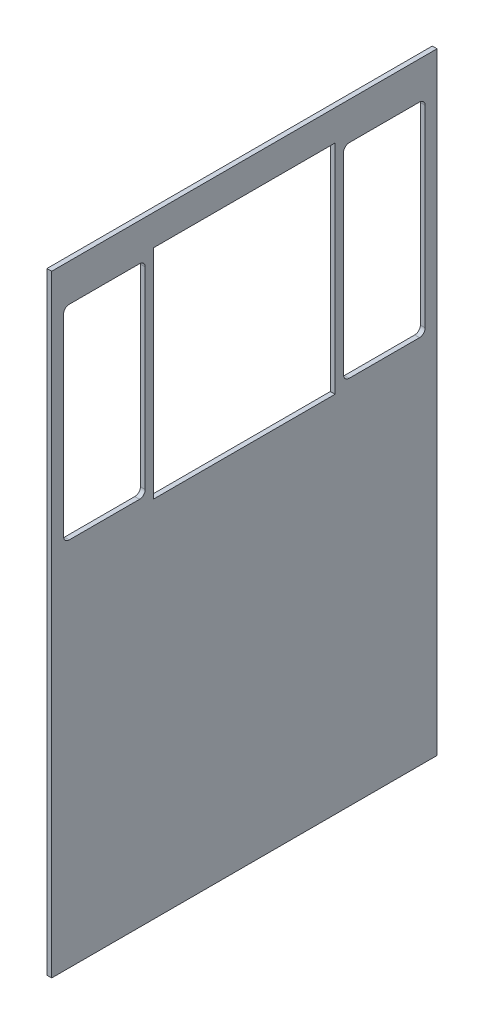
ISO-10303-21;
HEADER;
FILE_DESCRIPTION(('STEP AP214'),'2;1');
FILE_NAME('part.step','',(''),(''),'','','');
FILE_SCHEMA(('AUTOMOTIVE_DESIGN { 1 0 10303 214 1 1 1 1 }'));
ENDSEC;
DATA;
#1=APPLICATION_CONTEXT('core data for automotive mechanical design processes');
#2=APPLICATION_PROTOCOL_DEFINITION('international standard','automotive_design',2000,#1);
#3=PRODUCT_CONTEXT('',#1,'mechanical');
#4=PRODUCT('Part','Part','',(#3));
#5=PRODUCT_RELATED_PRODUCT_CATEGORY('part','',(#4));
#6=PRODUCT_DEFINITION_FORMATION('','',#4);
#7=PRODUCT_DEFINITION_CONTEXT('part definition',#1,'design');
#8=PRODUCT_DEFINITION('design','',#6,#7);
#9=PRODUCT_DEFINITION_SHAPE('','',#8);
#10=(LENGTH_UNIT() NAMED_UNIT(*) SI_UNIT(.MILLI.,.METRE.));
#11=(NAMED_UNIT(*) PLANE_ANGLE_UNIT() SI_UNIT($,.RADIAN.));
#12=(NAMED_UNIT(*) SI_UNIT($,.STERADIAN.) SOLID_ANGLE_UNIT());
#13=UNCERTAINTY_MEASURE_WITH_UNIT(LENGTH_MEASURE(1.E-05),#10,'distance_accuracy_value','');
#14=(GEOMETRIC_REPRESENTATION_CONTEXT(3) GLOBAL_UNCERTAINTY_ASSIGNED_CONTEXT((#13)) GLOBAL_UNIT_ASSIGNED_CONTEXT((#10,
#11,#12)) REPRESENTATION_CONTEXT('',''));
#15=CARTESIAN_POINT('',(0.,0.,0.));
#16=DIRECTION('',(0.,0.,1.));
#17=DIRECTION('',(1.,0.,0.));
#18=AXIS2_PLACEMENT_3D('',#15,#16,#17);
#19=CARTESIAN_POINT('',(2.667,0.,0.));
#20=DIRECTION('',(1.,0.,0.));
#21=DIRECTION('',(0.,0.,-1.));
#22=AXIS2_PLACEMENT_3D('',#19,#20,#21);
#23=PLANE('',#22);
#24=DIRECTION('',(0.,0.,1.));
#25=VECTOR('',#24,1.);
#26=CARTESIAN_POINT('',(2.667,321.945,-98.1075));
#27=LINE('',#26,#25);
#28=CARTESIAN_POINT('',(2.667,321.945,-98.1075));
#29=VERTEX_POINT('',#28);
#30=CARTESIAN_POINT('',(2.667,321.945,-58.7375));
#31=VERTEX_POINT('',#30);
#32=EDGE_CURVE('E231',#29,#31,#27,.T.);
#33=ORIENTED_EDGE('',*,*,#32,.F.);
#34=CARTESIAN_POINT('',(2.667,318.77,-98.1075));
#35=DIRECTION('',(1.,0.,0.));
#36=DIRECTION('',(0.,0.,1.));
#37=AXIS2_PLACEMENT_3D('',#34,#35,#36);
#38=CIRCLE('',#37,3.17499999999999);
#39=CARTESIAN_POINT('',(2.667,318.77,-101.2825));
#40=VERTEX_POINT('',#39);
#41=EDGE_CURVE('E229',#40,#29,#38,.T.);
#42=ORIENTED_EDGE('',*,*,#41,.F.);
#43=DIRECTION('',(0.,1.,0.));
#44=VECTOR('',#43,1.);
#45=CARTESIAN_POINT('',(2.667,210.82,-101.2825));
#46=LINE('',#45,#44);
#47=CARTESIAN_POINT('',(2.667,210.82,-101.2825));
#48=VERTEX_POINT('',#47);
#49=EDGE_CURVE('E244',#48,#40,#46,.T.);
#50=ORIENTED_EDGE('',*,*,#49,.F.);
#51=CARTESIAN_POINT('',(2.667,210.82,-98.1075));
#52=DIRECTION('',(1.,0.,0.));
#53=DIRECTION('',(0.,0.,1.));
#54=AXIS2_PLACEMENT_3D('',#51,#52,#53);
#55=CIRCLE('',#54,3.175);
#56=CARTESIAN_POINT('',(2.667,207.645,-98.1075));
#57=VERTEX_POINT('',#56);
#58=EDGE_CURVE('E242',#57,#48,#55,.T.);
#59=ORIENTED_EDGE('',*,*,#58,.F.);
#60=DIRECTION('',(0.,0.,-1.));
#61=VECTOR('',#60,1.);
#62=CARTESIAN_POINT('',(2.667,207.645,-98.1075));
#63=LINE('',#62,#61);
#64=CARTESIAN_POINT('',(2.667,207.645,-58.7375));
#65=VERTEX_POINT('',#64);
#66=EDGE_CURVE('E240',#65,#57,#63,.T.);
#67=ORIENTED_EDGE('',*,*,#66,.F.);
#68=CARTESIAN_POINT('',(2.667,210.82,-58.7375));
#69=DIRECTION('',(1.,0.,0.));
#70=DIRECTION('',(0.,0.,-1.));
#71=AXIS2_PLACEMENT_3D('',#68,#69,#70);
#72=CIRCLE('',#71,3.175);
#73=CARTESIAN_POINT('',(2.667,210.82,-55.5625));
#74=VERTEX_POINT('',#73);
#75=EDGE_CURVE('E238',#74,#65,#72,.T.);
#76=ORIENTED_EDGE('',*,*,#75,.F.);
#77=DIRECTION('',(0.,-1.,0.));
#78=VECTOR('',#77,1.);
#79=CARTESIAN_POINT('',(2.667,210.82,-55.5625));
#80=LINE('',#79,#78);
#81=CARTESIAN_POINT('',(2.667,318.77,-55.5625));
#82=VERTEX_POINT('',#81);
#83=EDGE_CURVE('E236',#82,#74,#80,.T.);
#84=ORIENTED_EDGE('',*,*,#83,.F.);
#85=CARTESIAN_POINT('',(2.667,318.77,-58.7375));
#86=DIRECTION('',(1.,0.,0.));
#87=DIRECTION('',(0.,0.,-1.));
#88=AXIS2_PLACEMENT_3D('',#85,#86,#87);
#89=CIRCLE('',#88,3.17499999999999);
#90=EDGE_CURVE('E234',#31,#82,#89,.T.);
#91=ORIENTED_EDGE('',*,*,#90,.F.);
#92=EDGE_LOOP('',(#33,#42,#50,#59,#67,#76,#84,#91));
#93=FACE_BOUND('',#92,.T.);
#94=DIRECTION('',(0.,0.,1.));
#95=VECTOR('',#94,1.);
#96=CARTESIAN_POINT('',(2.667,325.755,-50.8));
#97=LINE('',#96,#95);
#98=CARTESIAN_POINT('',(2.667,325.755,-50.8));
#99=VERTEX_POINT('',#98);
#100=CARTESIAN_POINT('',(2.667,325.755,50.8));
#101=VERTEX_POINT('',#100);
#102=EDGE_CURVE('E347',#99,#101,#97,.T.);
#103=ORIENTED_EDGE('',*,*,#102,.F.);
#104=DIRECTION('',(0.,1.,0.));
#105=VECTOR('',#104,1.);
#106=CARTESIAN_POINT('',(2.667,203.835,-50.8));
#107=LINE('',#106,#105);
#108=CARTESIAN_POINT('',(2.667,203.835,-50.8));
#109=VERTEX_POINT('',#108);
#110=EDGE_CURVE('E345',#109,#99,#107,.T.);
#111=ORIENTED_EDGE('',*,*,#110,.F.);
#112=DIRECTION('',(0.,0.,-1.));
#113=VECTOR('',#112,1.);
#114=CARTESIAN_POINT('',(2.667,203.835,-50.8));
#115=LINE('',#114,#113);
#116=CARTESIAN_POINT('',(2.667,203.835,50.8));
#117=VERTEX_POINT('',#116);
#118=EDGE_CURVE('E353',#117,#109,#115,.T.);
#119=ORIENTED_EDGE('',*,*,#118,.F.);
#120=DIRECTION('',(0.,-1.,0.));
#121=VECTOR('',#120,1.);
#122=CARTESIAN_POINT('',(2.667,203.835,50.8));
#123=LINE('',#122,#121);
#124=EDGE_CURVE('E350',#101,#117,#123,.T.);
#125=ORIENTED_EDGE('',*,*,#124,.F.);
#126=EDGE_LOOP('',(#103,#111,#119,#125));
#127=FACE_BOUND('',#126,.T.);
#128=DIRECTION('',(0.,1.,0.));
#129=VECTOR('',#128,1.);
#130=CARTESIAN_POINT('',(2.667,210.82,55.5625));
#131=LINE('',#130,#129);
#132=CARTESIAN_POINT('',(2.667,210.82,55.5625));
#133=VERTEX_POINT('',#132);
#134=CARTESIAN_POINT('',(2.667,318.77,55.5625));
#135=VERTEX_POINT('',#134);
#136=EDGE_CURVE('E288',#133,#135,#131,.T.);
#137=ORIENTED_EDGE('',*,*,#136,.F.);
#138=CARTESIAN_POINT('',(2.667,210.82,58.7375));
#139=DIRECTION('',(1.,0.,0.));
#140=DIRECTION('',(0.,0.,1.));
#141=AXIS2_PLACEMENT_3D('',#138,#139,#140);
#142=CIRCLE('',#141,3.175);
#143=CARTESIAN_POINT('',(2.667,207.645,58.7375));
#144=VERTEX_POINT('',#143);
#145=EDGE_CURVE('E286',#144,#133,#142,.T.);
#146=ORIENTED_EDGE('',*,*,#145,.F.);
#147=DIRECTION('',(0.,0.,-1.));
#148=VECTOR('',#147,1.);
#149=CARTESIAN_POINT('',(2.667,207.645,98.1075));
#150=LINE('',#149,#148);
#151=CARTESIAN_POINT('',(2.667,207.645,98.1075));
#152=VERTEX_POINT('',#151);
#153=EDGE_CURVE('E302',#152,#144,#150,.T.);
#154=ORIENTED_EDGE('',*,*,#153,.F.);
#155=CARTESIAN_POINT('',(2.667,210.82,98.1075));
#156=DIRECTION('',(1.,0.,0.));
#157=DIRECTION('',(0.,0.,-1.));
#158=AXIS2_PLACEMENT_3D('',#155,#156,#157);
#159=CIRCLE('',#158,3.175);
#160=CARTESIAN_POINT('',(2.667,210.82,101.2825));
#161=VERTEX_POINT('',#160);
#162=EDGE_CURVE('E299',#161,#152,#159,.T.);
#163=ORIENTED_EDGE('',*,*,#162,.F.);
#164=DIRECTION('',(0.,-1.,0.));
#165=VECTOR('',#164,1.);
#166=CARTESIAN_POINT('',(2.667,210.82,101.2825));
#167=LINE('',#166,#165);
#168=CARTESIAN_POINT('',(2.667,318.77,101.2825));
#169=VERTEX_POINT('',#168);
#170=EDGE_CURVE('E297',#169,#161,#167,.T.);
#171=ORIENTED_EDGE('',*,*,#170,.F.);
#172=CARTESIAN_POINT('',(2.667,318.77,98.1075));
#173=DIRECTION('',(1.,0.,0.));
#174=DIRECTION('',(0.,0.,-1.));
#175=AXIS2_PLACEMENT_3D('',#172,#173,#174);
#176=CIRCLE('',#175,3.17499999999999);
#177=CARTESIAN_POINT('',(2.667,321.945,98.1075));
#178=VERTEX_POINT('',#177);
#179=EDGE_CURVE('E295',#178,#169,#176,.T.);
#180=ORIENTED_EDGE('',*,*,#179,.F.);
#181=DIRECTION('',(0.,0.,1.));
#182=VECTOR('',#181,1.);
#183=CARTESIAN_POINT('',(2.667,321.945,98.1075));
#184=LINE('',#183,#182);
#185=CARTESIAN_POINT('',(2.667,321.945,58.7375));
#186=VERTEX_POINT('',#185);
#187=EDGE_CURVE('E293',#186,#178,#184,.T.);
#188=ORIENTED_EDGE('',*,*,#187,.F.);
#189=CARTESIAN_POINT('',(2.667,318.77,58.7375));
#190=DIRECTION('',(1.,0.,0.));
#191=DIRECTION('',(0.,0.,1.));
#192=AXIS2_PLACEMENT_3D('',#189,#190,#191);
#193=CIRCLE('',#192,3.17499999999999);
#194=EDGE_CURVE('E291',#135,#186,#193,.T.);
#195=ORIENTED_EDGE('',*,*,#194,.F.);
#196=EDGE_LOOP('',(#137,#146,#154,#163,#171,#180,#188,#195));
#197=FACE_BOUND('',#196,.T.);
#198=DIRECTION('',(0.,0.,1.));
#199=VECTOR('',#198,1.);
#200=CARTESIAN_POINT('',(2.667,342.9,0.));
#201=LINE('',#200,#199);
#202=CARTESIAN_POINT('',(2.667,342.9,-107.95));
#203=VERTEX_POINT('',#202);
#204=CARTESIAN_POINT('',(2.667,342.9,107.95));
#205=VERTEX_POINT('',#204);
#206=EDGE_CURVE('E217',#203,#205,#201,.T.);
#207=ORIENTED_EDGE('',*,*,#206,.T.);
#208=DIRECTION('',(0.,-1.,0.));
#209=VECTOR('',#208,1.);
#210=CARTESIAN_POINT('',(2.667,0.,107.95));
#211=LINE('',#210,#209);
#212=CARTESIAN_POINT('',(2.667,0.,107.95));
#213=VERTEX_POINT('',#212);
#214=EDGE_CURVE('E210',#205,#213,#211,.T.);
#215=ORIENTED_EDGE('',*,*,#214,.T.);
#216=DIRECTION('',(0.,0.,-1.));
#217=VECTOR('',#216,1.);
#218=CARTESIAN_POINT('',(2.667,0.,-114.3));
#219=LINE('',#218,#217);
#220=CARTESIAN_POINT('',(2.667,0.,-107.95));
#221=VERTEX_POINT('',#220);
#222=EDGE_CURVE('E11',#213,#221,#219,.T.);
#223=ORIENTED_EDGE('',*,*,#222,.T.);
#224=DIRECTION('',(0.,1.,0.));
#225=VECTOR('',#224,1.);
#226=CARTESIAN_POINT('',(2.667,0.,-107.95));
#227=LINE('',#226,#225);
#228=EDGE_CURVE('E47',#221,#203,#227,.T.);
#229=ORIENTED_EDGE('',*,*,#228,.T.);
#230=EDGE_LOOP('',(#207,#215,#223,#229));
#231=FACE_BOUND('',#230,.T.);
#232=ADVANCED_FACE('F32',(#93,#127,#197,#231),#23,.T.);
#233=CARTESIAN_POINT('',(0.,0.,0.));
#234=DIRECTION('',(1.,0.,0.));
#235=DIRECTION('',(0.,0.,-1.));
#236=AXIS2_PLACEMENT_3D('',#233,#234,#235);
#237=PLANE('',#236);
#238=CARTESIAN_POINT('',(0.,318.77,-98.1075));
#239=DIRECTION('',(1.,0.,0.));
#240=DIRECTION('',(0.,0.,1.));
#241=AXIS2_PLACEMENT_3D('',#238,#239,#240);
#242=CIRCLE('',#241,3.17499999999999);
#243=CARTESIAN_POINT('',(0.,318.77,-101.2825));
#244=VERTEX_POINT('',#243);
#245=CARTESIAN_POINT('',(0.,321.945,-98.1075));
#246=VERTEX_POINT('',#245);
#247=EDGE_CURVE('E225',#244,#246,#242,.T.);
#248=ORIENTED_EDGE('',*,*,#247,.T.);
#249=DIRECTION('',(0.,0.,1.));
#250=VECTOR('',#249,1.);
#251=CARTESIAN_POINT('',(0.,321.945,-98.1075));
#252=LINE('',#251,#250);
#253=CARTESIAN_POINT('',(0.,321.945,-58.7375));
#254=VERTEX_POINT('',#253);
#255=EDGE_CURVE('E249',#246,#254,#252,.T.);
#256=ORIENTED_EDGE('',*,*,#255,.T.);
#257=CARTESIAN_POINT('',(0.,318.77,-58.7375));
#258=DIRECTION('',(1.,0.,0.));
#259=DIRECTION('',(0.,0.,-1.));
#260=AXIS2_PLACEMENT_3D('',#257,#258,#259);
#261=CIRCLE('',#260,3.17499999999999);
#262=CARTESIAN_POINT('',(0.,318.77,-55.5625));
#263=VERTEX_POINT('',#262);
#264=EDGE_CURVE('E252',#254,#263,#261,.T.);
#265=ORIENTED_EDGE('',*,*,#264,.T.);
#266=DIRECTION('',(0.,-1.,0.));
#267=VECTOR('',#266,1.);
#268=CARTESIAN_POINT('',(0.,210.82,-55.5625));
#269=LINE('',#268,#267);
#270=CARTESIAN_POINT('',(0.,210.82,-55.5625));
#271=VERTEX_POINT('',#270);
#272=EDGE_CURVE('E255',#263,#271,#269,.T.);
#273=ORIENTED_EDGE('',*,*,#272,.T.);
#274=CARTESIAN_POINT('',(0.,210.82,-58.7375));
#275=DIRECTION('',(1.,0.,0.));
#276=DIRECTION('',(0.,0.,-1.));
#277=AXIS2_PLACEMENT_3D('',#274,#275,#276);
#278=CIRCLE('',#277,3.175);
#279=CARTESIAN_POINT('',(0.,207.645,-58.7375));
#280=VERTEX_POINT('',#279);
#281=EDGE_CURVE('E258',#271,#280,#278,.T.);
#282=ORIENTED_EDGE('',*,*,#281,.T.);
#283=DIRECTION('',(0.,0.,-1.));
#284=VECTOR('',#283,1.);
#285=CARTESIAN_POINT('',(0.,207.645,-98.1075));
#286=LINE('',#285,#284);
#287=CARTESIAN_POINT('',(0.,207.645,-98.1075));
#288=VERTEX_POINT('',#287);
#289=EDGE_CURVE('E261',#280,#288,#286,.T.);
#290=ORIENTED_EDGE('',*,*,#289,.T.);
#291=CARTESIAN_POINT('',(0.,210.82,-98.1075));
#292=DIRECTION('',(1.,0.,0.));
#293=DIRECTION('',(0.,0.,1.));
#294=AXIS2_PLACEMENT_3D('',#291,#292,#293);
#295=CIRCLE('',#294,3.175);
#296=CARTESIAN_POINT('',(0.,210.82,-101.2825));
#297=VERTEX_POINT('',#296);
#298=EDGE_CURVE('E264',#288,#297,#295,.T.);
#299=ORIENTED_EDGE('',*,*,#298,.T.);
#300=DIRECTION('',(0.,1.,0.));
#301=VECTOR('',#300,1.);
#302=CARTESIAN_POINT('',(0.,210.82,-101.2825));
#303=LINE('',#302,#301);
#304=EDGE_CURVE('E232',#297,#244,#303,.T.);
#305=ORIENTED_EDGE('',*,*,#304,.T.);
#306=EDGE_LOOP('',(#248,#256,#265,#273,#282,#290,#299,#305));
#307=FACE_BOUND('',#306,.T.);
#308=DIRECTION('',(0.,1.,0.));
#309=VECTOR('',#308,1.);
#310=CARTESIAN_POINT('',(0.,203.835,-50.8));
#311=LINE('',#310,#309);
#312=CARTESIAN_POINT('',(0.,203.835,-50.8));
#313=VERTEX_POINT('',#312);
#314=CARTESIAN_POINT('',(0.,325.755,-50.8));
#315=VERTEX_POINT('',#314);
#316=EDGE_CURVE('E344',#313,#315,#311,.T.);
#317=ORIENTED_EDGE('',*,*,#316,.T.);
#318=DIRECTION('',(0.,0.,1.));
#319=VECTOR('',#318,1.);
#320=CARTESIAN_POINT('',(0.,325.755,-50.8));
#321=LINE('',#320,#319);
#322=CARTESIAN_POINT('',(0.,325.755,50.8));
#323=VERTEX_POINT('',#322);
#324=EDGE_CURVE('E358',#315,#323,#321,.T.);
#325=ORIENTED_EDGE('',*,*,#324,.T.);
#326=DIRECTION('',(0.,-1.,0.));
#327=VECTOR('',#326,1.);
#328=CARTESIAN_POINT('',(0.,203.835,50.8));
#329=LINE('',#328,#327);
#330=CARTESIAN_POINT('',(0.,203.835,50.8));
#331=VERTEX_POINT('',#330);
#332=EDGE_CURVE('E361',#323,#331,#329,.T.);
#333=ORIENTED_EDGE('',*,*,#332,.T.);
#334=DIRECTION('',(0.,0.,-1.));
#335=VECTOR('',#334,1.);
#336=CARTESIAN_POINT('',(0.,203.835,-50.8));
#337=LINE('',#336,#335);
#338=EDGE_CURVE('E348',#331,#313,#337,.T.);
#339=ORIENTED_EDGE('',*,*,#338,.T.);
#340=EDGE_LOOP('',(#317,#325,#333,#339));
#341=FACE_BOUND('',#340,.T.);
#342=CARTESIAN_POINT('',(0.,210.82,58.7375));
#343=DIRECTION('',(1.,0.,0.));
#344=DIRECTION('',(0.,0.,1.));
#345=AXIS2_PLACEMENT_3D('',#342,#343,#344);
#346=CIRCLE('',#345,3.175);
#347=CARTESIAN_POINT('',(0.,207.645,58.7375));
#348=VERTEX_POINT('',#347);
#349=CARTESIAN_POINT('',(0.,210.82,55.5625));
#350=VERTEX_POINT('',#349);
#351=EDGE_CURVE('E285',#348,#350,#346,.T.);
#352=ORIENTED_EDGE('',*,*,#351,.T.);
#353=DIRECTION('',(0.,1.,0.));
#354=VECTOR('',#353,1.);
#355=CARTESIAN_POINT('',(0.,210.82,55.5625));
#356=LINE('',#355,#354);
#357=CARTESIAN_POINT('',(0.,318.77,55.5625));
#358=VERTEX_POINT('',#357);
#359=EDGE_CURVE('E307',#350,#358,#356,.T.);
#360=ORIENTED_EDGE('',*,*,#359,.T.);
#361=CARTESIAN_POINT('',(0.,318.77,58.7375));
#362=DIRECTION('',(1.,0.,0.));
#363=DIRECTION('',(0.,0.,1.));
#364=AXIS2_PLACEMENT_3D('',#361,#362,#363);
#365=CIRCLE('',#364,3.17499999999999);
#366=CARTESIAN_POINT('',(0.,321.945,58.7375));
#367=VERTEX_POINT('',#366);
#368=EDGE_CURVE('E310',#358,#367,#365,.T.);
#369=ORIENTED_EDGE('',*,*,#368,.T.);
#370=DIRECTION('',(0.,0.,1.));
#371=VECTOR('',#370,1.);
#372=CARTESIAN_POINT('',(0.,321.945,98.1075));
#373=LINE('',#372,#371);
#374=CARTESIAN_POINT('',(0.,321.945,98.1075));
#375=VERTEX_POINT('',#374);
#376=EDGE_CURVE('E313',#367,#375,#373,.T.);
#377=ORIENTED_EDGE('',*,*,#376,.T.);
#378=CARTESIAN_POINT('',(0.,318.77,98.1075));
#379=DIRECTION('',(1.,0.,0.));
#380=DIRECTION('',(0.,0.,-1.));
#381=AXIS2_PLACEMENT_3D('',#378,#379,#380);
#382=CIRCLE('',#381,3.17499999999999);
#383=CARTESIAN_POINT('',(0.,318.77,101.2825));
#384=VERTEX_POINT('',#383);
#385=EDGE_CURVE('E316',#375,#384,#382,.T.);
#386=ORIENTED_EDGE('',*,*,#385,.T.);
#387=DIRECTION('',(0.,-1.,0.));
#388=VECTOR('',#387,1.);
#389=CARTESIAN_POINT('',(0.,210.82,101.2825));
#390=LINE('',#389,#388);
#391=CARTESIAN_POINT('',(0.,210.82,101.2825));
#392=VERTEX_POINT('',#391);
#393=EDGE_CURVE('E319',#384,#392,#390,.T.);
#394=ORIENTED_EDGE('',*,*,#393,.T.);
#395=CARTESIAN_POINT('',(0.,210.82,98.1075));
#396=DIRECTION('',(1.,0.,0.));
#397=DIRECTION('',(0.,0.,-1.));
#398=AXIS2_PLACEMENT_3D('',#395,#396,#397);
#399=CIRCLE('',#398,3.175);
#400=CARTESIAN_POINT('',(0.,207.645,98.1075));
#401=VERTEX_POINT('',#400);
#402=EDGE_CURVE('E322',#392,#401,#399,.T.);
#403=ORIENTED_EDGE('',*,*,#402,.T.);
#404=DIRECTION('',(0.,0.,-1.));
#405=VECTOR('',#404,1.);
#406=CARTESIAN_POINT('',(0.,207.645,98.1075));
#407=LINE('',#406,#405);
#408=EDGE_CURVE('E289',#401,#348,#407,.T.);
#409=ORIENTED_EDGE('',*,*,#408,.T.);
#410=EDGE_LOOP('',(#352,#360,#369,#377,#386,#394,#403,#409));
#411=FACE_BOUND('',#410,.T.);
#412=DIRECTION('',(0.,-1.,0.));
#413=VECTOR('',#412,1.);
#414=CARTESIAN_POINT('',(0.,0.,107.95));
#415=LINE('',#414,#413);
#416=CARTESIAN_POINT('',(0.,342.9,107.95));
#417=VERTEX_POINT('',#416);
#418=CARTESIAN_POINT('',(0.,0.,107.95));
#419=VERTEX_POINT('',#418);
#420=EDGE_CURVE('E204',#417,#419,#415,.T.);
#421=ORIENTED_EDGE('',*,*,#420,.F.);
#422=DIRECTION('',(0.,0.,1.));
#423=VECTOR('',#422,1.);
#424=CARTESIAN_POINT('',(0.,342.9,0.));
#425=LINE('',#424,#423);
#426=CARTESIAN_POINT('',(0.,342.9,-107.95));
#427=VERTEX_POINT('',#426);
#428=EDGE_CURVE('E193',#427,#417,#425,.T.);
#429=ORIENTED_EDGE('',*,*,#428,.F.);
#430=DIRECTION('',(0.,1.,0.));
#431=VECTOR('',#430,1.);
#432=CARTESIAN_POINT('',(0.,0.,-107.95));
#433=LINE('',#432,#431);
#434=CARTESIAN_POINT('',(0.,0.,-107.95));
#435=VERTEX_POINT('',#434);
#436=EDGE_CURVE('E203',#435,#427,#433,.T.);
#437=ORIENTED_EDGE('',*,*,#436,.F.);
#438=DIRECTION('',(0.,0.,-1.));
#439=VECTOR('',#438,1.);
#440=CARTESIAN_POINT('',(0.,0.,-114.3));
#441=LINE('',#440,#439);
#442=EDGE_CURVE('E36',#419,#435,#441,.T.);
#443=ORIENTED_EDGE('',*,*,#442,.F.);
#444=EDGE_LOOP('',(#421,#429,#437,#443));
#445=FACE_BOUND('',#444,.T.);
#446=ADVANCED_FACE('F214',(#307,#341,#411,#445),#237,.F.);
#447=CARTESIAN_POINT('',(2.667,0.,-114.3));
#448=DIRECTION('',(0.,1.,0.));
#449=DIRECTION('',(0.,0.,1.));
#450=AXIS2_PLACEMENT_3D('',#447,#448,#449);
#451=PLANE('',#450);
#452=DIRECTION('',(1.,0.,0.));
#453=VECTOR('',#452,1.);
#454=CARTESIAN_POINT('',(0.,0.,107.95));
#455=LINE('',#454,#453);
#456=EDGE_CURVE('E223',#419,#213,#455,.T.);
#457=ORIENTED_EDGE('',*,*,#456,.F.);
#458=ORIENTED_EDGE('',*,*,#442,.T.);
#459=DIRECTION('',(1.,0.,0.));
#460=VECTOR('',#459,1.);
#461=CARTESIAN_POINT('',(0.,0.,-107.95));
#462=LINE('',#461,#460);
#463=EDGE_CURVE('E226',#435,#221,#462,.T.);
#464=ORIENTED_EDGE('',*,*,#463,.T.);
#465=ORIENTED_EDGE('',*,*,#222,.F.);
#466=EDGE_LOOP('',(#457,#458,#464,#465));
#467=FACE_BOUND('',#466,.T.);
#468=ADVANCED_FACE('F34',(#467),#451,.F.);
#469=CARTESIAN_POINT('',(2.667,203.835,-50.8));
#470=DIRECTION('',(0.,0.,1.));
#471=DIRECTION('',(1.,0.,0.));
#472=AXIS2_PLACEMENT_3D('',#469,#470,#471);
#473=PLANE('',#472);
#474=ORIENTED_EDGE('',*,*,#316,.F.);
#475=DIRECTION('',(-1.,0.,0.));
#476=VECTOR('',#475,1.);
#477=CARTESIAN_POINT('',(2.667,203.835,-50.8));
#478=LINE('',#477,#476);
#479=EDGE_CURVE('E355',#109,#313,#478,.T.);
#480=ORIENTED_EDGE('',*,*,#479,.F.);
#481=ORIENTED_EDGE('',*,*,#110,.T.);
#482=DIRECTION('',(-1.,0.,0.));
#483=VECTOR('',#482,1.);
#484=CARTESIAN_POINT('',(2.667,325.755,-50.8));
#485=LINE('',#484,#483);
#486=EDGE_CURVE('E372',#99,#315,#485,.T.);
#487=ORIENTED_EDGE('',*,*,#486,.T.);
#488=EDGE_LOOP('',(#474,#480,#481,#487));
#489=FACE_BOUND('',#488,.T.);
#490=ADVANCED_FACE('F389',(#489),#473,.T.);
#491=CARTESIAN_POINT('',(2.667,325.755,-50.8));
#492=DIRECTION('',(0.,-1.,0.));
#493=DIRECTION('',(0.,0.,-1.));
#494=AXIS2_PLACEMENT_3D('',#491,#492,#493);
#495=PLANE('',#494);
#496=ORIENTED_EDGE('',*,*,#324,.F.);
#497=ORIENTED_EDGE('',*,*,#486,.F.);
#498=ORIENTED_EDGE('',*,*,#102,.T.);
#499=DIRECTION('',(-1.,0.,0.));
#500=VECTOR('',#499,1.);
#501=CARTESIAN_POINT('',(2.667,325.755,50.8));
#502=LINE('',#501,#500);
#503=EDGE_CURVE('E370',#101,#323,#502,.T.);
#504=ORIENTED_EDGE('',*,*,#503,.T.);
#505=EDGE_LOOP('',(#496,#497,#498,#504));
#506=FACE_BOUND('',#505,.T.);
#507=ADVANCED_FACE('F392',(#506),#495,.T.);
#508=CARTESIAN_POINT('',(2.667,203.835,50.8));
#509=DIRECTION('',(0.,0.,-1.));
#510=DIRECTION('',(-1.,0.,0.));
#511=AXIS2_PLACEMENT_3D('',#508,#509,#510);
#512=PLANE('',#511);
#513=ORIENTED_EDGE('',*,*,#332,.F.);
#514=ORIENTED_EDGE('',*,*,#503,.F.);
#515=ORIENTED_EDGE('',*,*,#124,.T.);
#516=DIRECTION('',(-1.,0.,0.));
#517=VECTOR('',#516,1.);
#518=CARTESIAN_POINT('',(2.667,203.835,50.8));
#519=LINE('',#518,#517);
#520=EDGE_CURVE('E368',#117,#331,#519,.T.);
#521=ORIENTED_EDGE('',*,*,#520,.T.);
#522=EDGE_LOOP('',(#513,#514,#515,#521));
#523=FACE_BOUND('',#522,.T.);
#524=ADVANCED_FACE('F395',(#523),#512,.T.);
#525=CARTESIAN_POINT('',(2.667,203.835,-50.8));
#526=DIRECTION('',(0.,1.,0.));
#527=DIRECTION('',(0.,0.,1.));
#528=AXIS2_PLACEMENT_3D('',#525,#526,#527);
#529=PLANE('',#528);
#530=ORIENTED_EDGE('',*,*,#338,.F.);
#531=ORIENTED_EDGE('',*,*,#520,.F.);
#532=ORIENTED_EDGE('',*,*,#118,.T.);
#533=ORIENTED_EDGE('',*,*,#479,.T.);
#534=EDGE_LOOP('',(#530,#531,#532,#533));
#535=FACE_BOUND('',#534,.T.);
#536=ADVANCED_FACE('F399',(#535),#529,.T.);
#537=CARTESIAN_POINT('',(2.667,210.82,58.7375));
#538=DIRECTION('',(-1.,0.,0.));
#539=DIRECTION('',(0.,0.,1.));
#540=AXIS2_PLACEMENT_3D('',#537,#538,#539);
#541=CYLINDRICAL_SURFACE('',#540,3.175);
#542=ORIENTED_EDGE('',*,*,#351,.F.);
#543=DIRECTION('',(-1.,0.,0.));
#544=VECTOR('',#543,1.);
#545=CARTESIAN_POINT('',(2.667,207.645,58.7375));
#546=LINE('',#545,#544);
#547=EDGE_CURVE('E304',#144,#348,#546,.T.);
#548=ORIENTED_EDGE('',*,*,#547,.F.);
#549=ORIENTED_EDGE('',*,*,#145,.T.);
#550=DIRECTION('',(-1.,0.,0.));
#551=VECTOR('',#550,1.);
#552=CARTESIAN_POINT('',(2.667,210.82,55.5625));
#553=LINE('',#552,#551);
#554=EDGE_CURVE('E341',#133,#350,#553,.T.);
#555=ORIENTED_EDGE('',*,*,#554,.T.);
#556=EDGE_LOOP('',(#542,#548,#549,#555));
#557=FACE_BOUND('',#556,.T.);
#558=ADVANCED_FACE('F403',(#557),#541,.F.);
#559=CARTESIAN_POINT('',(2.667,210.82,55.5625));
#560=DIRECTION('',(0.,0.,1.));
#561=DIRECTION('',(1.,0.,0.));
#562=AXIS2_PLACEMENT_3D('',#559,#560,#561);
#563=PLANE('',#562);
#564=ORIENTED_EDGE('',*,*,#359,.F.);
#565=ORIENTED_EDGE('',*,*,#554,.F.);
#566=ORIENTED_EDGE('',*,*,#136,.T.);
#567=DIRECTION('',(-1.,0.,0.));
#568=VECTOR('',#567,1.);
#569=CARTESIAN_POINT('',(2.667,318.77,55.5625));
#570=LINE('',#569,#568);
#571=EDGE_CURVE('E339',#135,#358,#570,.T.);
#572=ORIENTED_EDGE('',*,*,#571,.T.);
#573=EDGE_LOOP('',(#564,#565,#566,#572));
#574=FACE_BOUND('',#573,.T.);
#575=ADVANCED_FACE('F407',(#574),#563,.T.);
#576=CARTESIAN_POINT('',(2.667,318.77,58.7375));
#577=DIRECTION('',(-1.,0.,0.));
#578=DIRECTION('',(0.,0.,1.));
#579=AXIS2_PLACEMENT_3D('',#576,#577,#578);
#580=CYLINDRICAL_SURFACE('',#579,3.17499999999999);
#581=ORIENTED_EDGE('',*,*,#368,.F.);
#582=ORIENTED_EDGE('',*,*,#571,.F.);
#583=ORIENTED_EDGE('',*,*,#194,.T.);
#584=DIRECTION('',(-1.,0.,0.));
#585=VECTOR('',#584,1.);
#586=CARTESIAN_POINT('',(2.667,321.945,58.7375));
#587=LINE('',#586,#585);
#588=EDGE_CURVE('E337',#186,#367,#587,.T.);
#589=ORIENTED_EDGE('',*,*,#588,.T.);
#590=EDGE_LOOP('',(#581,#582,#583,#589));
#591=FACE_BOUND('',#590,.T.);
#592=ADVANCED_FACE('F411',(#591),#580,.F.);
#593=CARTESIAN_POINT('',(2.667,321.945,98.1075));
#594=DIRECTION('',(0.,-1.,0.));
#595=DIRECTION('',(0.,0.,-1.));
#596=AXIS2_PLACEMENT_3D('',#593,#594,#595);
#597=PLANE('',#596);
#598=ORIENTED_EDGE('',*,*,#376,.F.);
#599=ORIENTED_EDGE('',*,*,#588,.F.);
#600=ORIENTED_EDGE('',*,*,#187,.T.);
#601=DIRECTION('',(-1.,0.,0.));
#602=VECTOR('',#601,1.);
#603=CARTESIAN_POINT('',(2.667,321.945,98.1075));
#604=LINE('',#603,#602);
#605=EDGE_CURVE('E335',#178,#375,#604,.T.);
#606=ORIENTED_EDGE('',*,*,#605,.T.);
#607=EDGE_LOOP('',(#598,#599,#600,#606));
#608=FACE_BOUND('',#607,.T.);
#609=ADVANCED_FACE('F415',(#608),#597,.T.);
#610=CARTESIAN_POINT('',(2.667,318.77,98.1075));
#611=DIRECTION('',(-1.,0.,0.));
#612=DIRECTION('',(0.,0.,1.));
#613=AXIS2_PLACEMENT_3D('',#610,#611,#612);
#614=CYLINDRICAL_SURFACE('',#613,3.17499999999999);
#615=ORIENTED_EDGE('',*,*,#385,.F.);
#616=ORIENTED_EDGE('',*,*,#605,.F.);
#617=ORIENTED_EDGE('',*,*,#179,.T.);
#618=DIRECTION('',(-1.,0.,0.));
#619=VECTOR('',#618,1.);
#620=CARTESIAN_POINT('',(2.667,318.77,101.2825));
#621=LINE('',#620,#619);
#622=EDGE_CURVE('E333',#169,#384,#621,.T.);
#623=ORIENTED_EDGE('',*,*,#622,.T.);
#624=EDGE_LOOP('',(#615,#616,#617,#623));
#625=FACE_BOUND('',#624,.T.);
#626=ADVANCED_FACE('F419',(#625),#614,.F.);
#627=CARTESIAN_POINT('',(2.667,210.82,101.2825));
#628=DIRECTION('',(0.,0.,-1.));
#629=DIRECTION('',(-1.,0.,0.));
#630=AXIS2_PLACEMENT_3D('',#627,#628,#629);
#631=PLANE('',#630);
#632=ORIENTED_EDGE('',*,*,#393,.F.);
#633=ORIENTED_EDGE('',*,*,#622,.F.);
#634=ORIENTED_EDGE('',*,*,#170,.T.);
#635=DIRECTION('',(-1.,0.,0.));
#636=VECTOR('',#635,1.);
#637=CARTESIAN_POINT('',(2.667,210.82,101.2825));
#638=LINE('',#637,#636);
#639=EDGE_CURVE('E331',#161,#392,#638,.T.);
#640=ORIENTED_EDGE('',*,*,#639,.T.);
#641=EDGE_LOOP('',(#632,#633,#634,#640));
#642=FACE_BOUND('',#641,.T.);
#643=ADVANCED_FACE('F423',(#642),#631,.T.);
#644=CARTESIAN_POINT('',(2.667,210.82,98.1075));
#645=DIRECTION('',(-1.,0.,0.));
#646=DIRECTION('',(0.,0.,1.));
#647=AXIS2_PLACEMENT_3D('',#644,#645,#646);
#648=CYLINDRICAL_SURFACE('',#647,3.175);
#649=ORIENTED_EDGE('',*,*,#402,.F.);
#650=ORIENTED_EDGE('',*,*,#639,.F.);
#651=ORIENTED_EDGE('',*,*,#162,.T.);
#652=DIRECTION('',(-1.,0.,0.));
#653=VECTOR('',#652,1.);
#654=CARTESIAN_POINT('',(2.667,207.645,98.1075));
#655=LINE('',#654,#653);
#656=EDGE_CURVE('E329',#152,#401,#655,.T.);
#657=ORIENTED_EDGE('',*,*,#656,.T.);
#658=EDGE_LOOP('',(#649,#650,#651,#657));
#659=FACE_BOUND('',#658,.T.);
#660=ADVANCED_FACE('F427',(#659),#648,.F.);
#661=CARTESIAN_POINT('',(2.667,207.645,98.1075));
#662=DIRECTION('',(0.,1.,0.));
#663=DIRECTION('',(0.,0.,1.));
#664=AXIS2_PLACEMENT_3D('',#661,#662,#663);
#665=PLANE('',#664);
#666=ORIENTED_EDGE('',*,*,#408,.F.);
#667=ORIENTED_EDGE('',*,*,#656,.F.);
#668=ORIENTED_EDGE('',*,*,#153,.T.);
#669=ORIENTED_EDGE('',*,*,#547,.T.);
#670=EDGE_LOOP('',(#666,#667,#668,#669));
#671=FACE_BOUND('',#670,.T.);
#672=ADVANCED_FACE('F431',(#671),#665,.T.);
#673=CARTESIAN_POINT('',(2.667,318.77,-98.1075));
#674=DIRECTION('',(-1.,0.,0.));
#675=DIRECTION('',(0.,0.,1.));
#676=AXIS2_PLACEMENT_3D('',#673,#674,#675);
#677=CYLINDRICAL_SURFACE('',#676,3.17499999999999);
#678=ORIENTED_EDGE('',*,*,#247,.F.);
#679=DIRECTION('',(-1.,0.,0.));
#680=VECTOR('',#679,1.);
#681=CARTESIAN_POINT('',(2.667,318.77,-101.2825));
#682=LINE('',#681,#680);
#683=EDGE_CURVE('E246',#40,#244,#682,.T.);
#684=ORIENTED_EDGE('',*,*,#683,.F.);
#685=ORIENTED_EDGE('',*,*,#41,.T.);
#686=DIRECTION('',(-1.,0.,0.));
#687=VECTOR('',#686,1.);
#688=CARTESIAN_POINT('',(2.667,321.945,-98.1075));
#689=LINE('',#688,#687);
#690=EDGE_CURVE('E282',#29,#246,#689,.T.);
#691=ORIENTED_EDGE('',*,*,#690,.T.);
#692=EDGE_LOOP('',(#678,#684,#685,#691));
#693=FACE_BOUND('',#692,.T.);
#694=ADVANCED_FACE('F435',(#693),#677,.F.);
#695=CARTESIAN_POINT('',(2.667,321.945,-98.1075));
#696=DIRECTION('',(0.,-1.,0.));
#697=DIRECTION('',(0.,0.,-1.));
#698=AXIS2_PLACEMENT_3D('',#695,#696,#697);
#699=PLANE('',#698);
#700=ORIENTED_EDGE('',*,*,#255,.F.);
#701=ORIENTED_EDGE('',*,*,#690,.F.);
#702=ORIENTED_EDGE('',*,*,#32,.T.);
#703=DIRECTION('',(-1.,0.,0.));
#704=VECTOR('',#703,1.);
#705=CARTESIAN_POINT('',(2.667,321.945,-58.7375));
#706=LINE('',#705,#704);
#707=EDGE_CURVE('E280',#31,#254,#706,.T.);
#708=ORIENTED_EDGE('',*,*,#707,.T.);
#709=EDGE_LOOP('',(#700,#701,#702,#708));
#710=FACE_BOUND('',#709,.T.);
#711=ADVANCED_FACE('F439',(#710),#699,.T.);
#712=CARTESIAN_POINT('',(2.667,318.77,-58.7375));
#713=DIRECTION('',(-1.,0.,0.));
#714=DIRECTION('',(0.,0.,1.));
#715=AXIS2_PLACEMENT_3D('',#712,#713,#714);
#716=CYLINDRICAL_SURFACE('',#715,3.17499999999999);
#717=ORIENTED_EDGE('',*,*,#264,.F.);
#718=ORIENTED_EDGE('',*,*,#707,.F.);
#719=ORIENTED_EDGE('',*,*,#90,.T.);
#720=DIRECTION('',(-1.,0.,0.));
#721=VECTOR('',#720,1.);
#722=CARTESIAN_POINT('',(2.667,318.77,-55.5625));
#723=LINE('',#722,#721);
#724=EDGE_CURVE('E278',#82,#263,#723,.T.);
#725=ORIENTED_EDGE('',*,*,#724,.T.);
#726=EDGE_LOOP('',(#717,#718,#719,#725));
#727=FACE_BOUND('',#726,.T.);
#728=ADVANCED_FACE('F443',(#727),#716,.F.);
#729=CARTESIAN_POINT('',(2.667,210.82,-55.5625));
#730=DIRECTION('',(0.,0.,-1.));
#731=DIRECTION('',(-1.,0.,0.));
#732=AXIS2_PLACEMENT_3D('',#729,#730,#731);
#733=PLANE('',#732);
#734=ORIENTED_EDGE('',*,*,#272,.F.);
#735=ORIENTED_EDGE('',*,*,#724,.F.);
#736=ORIENTED_EDGE('',*,*,#83,.T.);
#737=DIRECTION('',(-1.,0.,0.));
#738=VECTOR('',#737,1.);
#739=CARTESIAN_POINT('',(2.667,210.82,-55.5625));
#740=LINE('',#739,#738);
#741=EDGE_CURVE('E276',#74,#271,#740,.T.);
#742=ORIENTED_EDGE('',*,*,#741,.T.);
#743=EDGE_LOOP('',(#734,#735,#736,#742));
#744=FACE_BOUND('',#743,.T.);
#745=ADVANCED_FACE('F447',(#744),#733,.T.);
#746=CARTESIAN_POINT('',(2.667,210.82,-58.7375));
#747=DIRECTION('',(-1.,0.,0.));
#748=DIRECTION('',(0.,0.,1.));
#749=AXIS2_PLACEMENT_3D('',#746,#747,#748);
#750=CYLINDRICAL_SURFACE('',#749,3.175);
#751=ORIENTED_EDGE('',*,*,#281,.F.);
#752=ORIENTED_EDGE('',*,*,#741,.F.);
#753=ORIENTED_EDGE('',*,*,#75,.T.);
#754=DIRECTION('',(-1.,0.,0.));
#755=VECTOR('',#754,1.);
#756=CARTESIAN_POINT('',(2.667,207.645,-58.7375));
#757=LINE('',#756,#755);
#758=EDGE_CURVE('E274',#65,#280,#757,.T.);
#759=ORIENTED_EDGE('',*,*,#758,.T.);
#760=EDGE_LOOP('',(#751,#752,#753,#759));
#761=FACE_BOUND('',#760,.T.);
#762=ADVANCED_FACE('F451',(#761),#750,.F.);
#763=CARTESIAN_POINT('',(2.667,207.645,-98.1075));
#764=DIRECTION('',(0.,1.,0.));
#765=DIRECTION('',(0.,0.,1.));
#766=AXIS2_PLACEMENT_3D('',#763,#764,#765);
#767=PLANE('',#766);
#768=ORIENTED_EDGE('',*,*,#289,.F.);
#769=ORIENTED_EDGE('',*,*,#758,.F.);
#770=ORIENTED_EDGE('',*,*,#66,.T.);
#771=DIRECTION('',(-1.,0.,0.));
#772=VECTOR('',#771,1.);
#773=CARTESIAN_POINT('',(2.667,207.645,-98.1075));
#774=LINE('',#773,#772);
#775=EDGE_CURVE('E272',#57,#288,#774,.T.);
#776=ORIENTED_EDGE('',*,*,#775,.T.);
#777=EDGE_LOOP('',(#768,#769,#770,#776));
#778=FACE_BOUND('',#777,.T.);
#779=ADVANCED_FACE('F455',(#778),#767,.T.);
#780=CARTESIAN_POINT('',(2.667,210.82,-98.1075));
#781=DIRECTION('',(-1.,0.,0.));
#782=DIRECTION('',(0.,0.,1.));
#783=AXIS2_PLACEMENT_3D('',#780,#781,#782);
#784=CYLINDRICAL_SURFACE('',#783,3.175);
#785=ORIENTED_EDGE('',*,*,#298,.F.);
#786=ORIENTED_EDGE('',*,*,#775,.F.);
#787=ORIENTED_EDGE('',*,*,#58,.T.);
#788=DIRECTION('',(-1.,0.,0.));
#789=VECTOR('',#788,1.);
#790=CARTESIAN_POINT('',(2.667,210.82,-101.2825));
#791=LINE('',#790,#789);
#792=EDGE_CURVE('E55',#48,#297,#791,.T.);
#793=ORIENTED_EDGE('',*,*,#792,.T.);
#794=EDGE_LOOP('',(#785,#786,#787,#793));
#795=FACE_BOUND('',#794,.T.);
#796=ADVANCED_FACE('F459',(#795),#784,.F.);
#797=CARTESIAN_POINT('',(2.667,210.82,-101.2825));
#798=DIRECTION('',(0.,0.,1.));
#799=DIRECTION('',(1.,0.,0.));
#800=AXIS2_PLACEMENT_3D('',#797,#798,#799);
#801=PLANE('',#800);
#802=ORIENTED_EDGE('',*,*,#304,.F.);
#803=ORIENTED_EDGE('',*,*,#792,.F.);
#804=ORIENTED_EDGE('',*,*,#49,.T.);
#805=ORIENTED_EDGE('',*,*,#683,.T.);
#806=EDGE_LOOP('',(#802,#803,#804,#805));
#807=FACE_BOUND('',#806,.T.);
#808=ADVANCED_FACE('F463',(#807),#801,.T.);
#809=CARTESIAN_POINT('',(0.,0.,107.95));
#810=DIRECTION('',(0.,0.,1.));
#811=DIRECTION('',(0.,-1.,0.));
#812=AXIS2_PLACEMENT_3D('',#809,#810,#811);
#813=PLANE('',#812);
#814=ORIENTED_EDGE('',*,*,#214,.F.);
#815=DIRECTION('',(1.,0.,0.));
#816=VECTOR('',#815,1.);
#817=CARTESIAN_POINT('',(0.,342.9,107.95));
#818=LINE('',#817,#816);
#819=EDGE_CURVE('E197',#417,#205,#818,.T.);
#820=ORIENTED_EDGE('',*,*,#819,.F.);
#821=ORIENTED_EDGE('',*,*,#420,.T.);
#822=ORIENTED_EDGE('',*,*,#456,.T.);
#823=EDGE_LOOP('',(#814,#820,#821,#822));
#824=FACE_BOUND('',#823,.T.);
#825=ADVANCED_FACE('F207',(#824),#813,.T.);
#826=CARTESIAN_POINT('',(0.,0.,-107.95));
#827=DIRECTION('',(0.,0.,-1.));
#828=DIRECTION('',(-1.,0.,0.));
#829=AXIS2_PLACEMENT_3D('',#826,#827,#828);
#830=PLANE('',#829);
#831=ORIENTED_EDGE('',*,*,#228,.F.);
#832=ORIENTED_EDGE('',*,*,#463,.F.);
#833=ORIENTED_EDGE('',*,*,#436,.T.);
#834=DIRECTION('',(1.,0.,0.));
#835=VECTOR('',#834,1.);
#836=CARTESIAN_POINT('',(0.,342.9,-107.95));
#837=LINE('',#836,#835);
#838=EDGE_CURVE('E199',#427,#203,#837,.T.);
#839=ORIENTED_EDGE('',*,*,#838,.T.);
#840=EDGE_LOOP('',(#831,#832,#833,#839));
#841=FACE_BOUND('',#840,.T.);
#842=ADVANCED_FACE('F469',(#841),#830,.T.);
#843=CARTESIAN_POINT('',(0.,342.9,0.));
#844=DIRECTION('',(0.,1.,0.));
#845=DIRECTION('',(0.,0.,1.));
#846=AXIS2_PLACEMENT_3D('',#843,#844,#845);
#847=PLANE('',#846);
#848=ORIENTED_EDGE('',*,*,#206,.F.);
#849=ORIENTED_EDGE('',*,*,#838,.F.);
#850=ORIENTED_EDGE('',*,*,#428,.T.);
#851=ORIENTED_EDGE('',*,*,#819,.T.);
#852=EDGE_LOOP('',(#848,#849,#850,#851));
#853=FACE_BOUND('',#852,.T.);
#854=ADVANCED_FACE('F196',(#853),#847,.T.);
#855=CLOSED_SHELL('',(#232,#446,#468,#490,#507,#524,#536,#558,#575,#592,#609,#626,#643,#660,
#672,#694,#711,#728,#745,#762,#779,#796,#808,#825,#842,#854));
#856=MANIFOLD_SOLID_BREP('B2',#855);
#857=ADVANCED_BREP_SHAPE_REPRESENTATION('',(#18,#856),#14);
#858=SHAPE_DEFINITION_REPRESENTATION(#9,#857);
ENDSEC;
END-ISO-10303-21;
